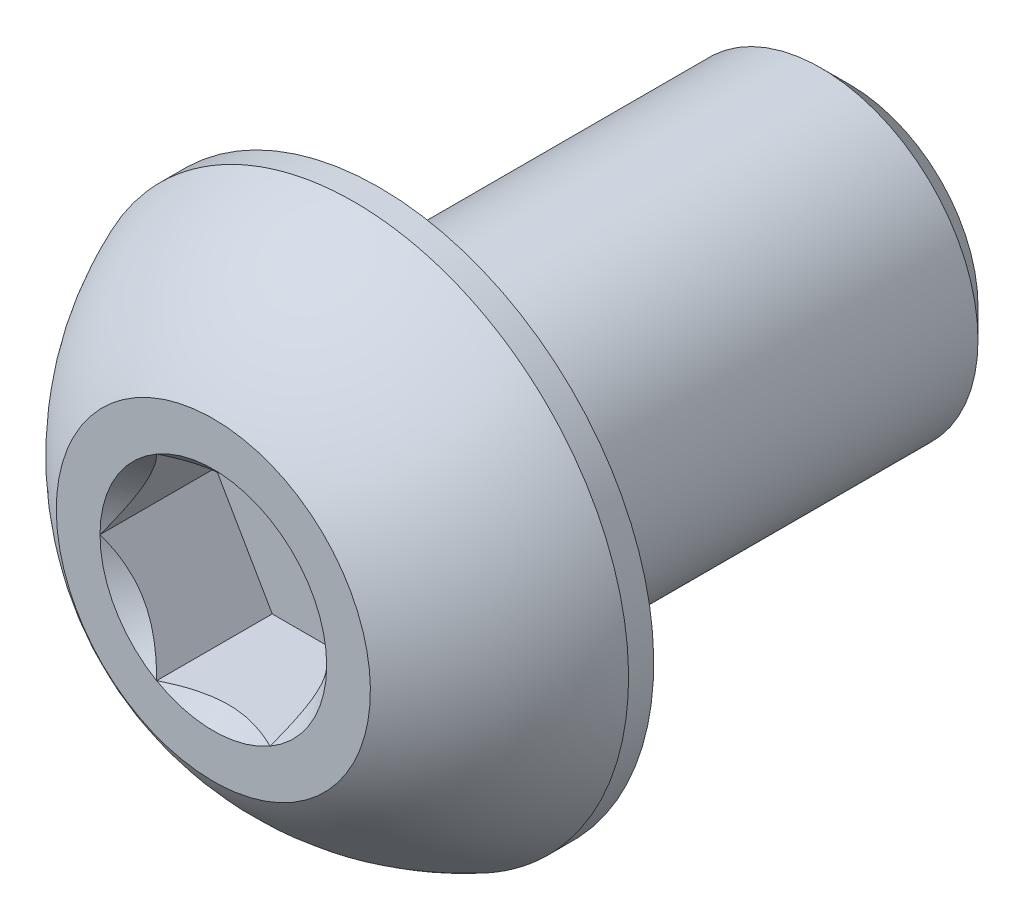
ISO-10303-21;
HEADER;
FILE_DESCRIPTION(('STEP AP214'),'2;1');
FILE_NAME('part.step','',(''),(''),'','','');
FILE_SCHEMA(('AUTOMOTIVE_DESIGN { 1 0 10303 214 1 1 1 1 }'));
ENDSEC;
DATA;
#1=APPLICATION_CONTEXT('core data for automotive mechanical design processes');
#2=APPLICATION_PROTOCOL_DEFINITION('international standard','automotive_design',2000,#1);
#3=PRODUCT_CONTEXT('',#1,'mechanical');
#4=PRODUCT('Part','Part','',(#3));
#5=PRODUCT_RELATED_PRODUCT_CATEGORY('part','',(#4));
#6=PRODUCT_DEFINITION_FORMATION('','',#4);
#7=PRODUCT_DEFINITION_CONTEXT('part definition',#1,'design');
#8=PRODUCT_DEFINITION('design','',#6,#7);
#9=PRODUCT_DEFINITION_SHAPE('','',#8);
#10=(LENGTH_UNIT() NAMED_UNIT(*) SI_UNIT(.MILLI.,.METRE.));
#11=(NAMED_UNIT(*) PLANE_ANGLE_UNIT() SI_UNIT($,.RADIAN.));
#12=(NAMED_UNIT(*) SI_UNIT($,.STERADIAN.) SOLID_ANGLE_UNIT());
#13=UNCERTAINTY_MEASURE_WITH_UNIT(LENGTH_MEASURE(1.E-05),#10,'distance_accuracy_value','');
#14=(GEOMETRIC_REPRESENTATION_CONTEXT(3) GLOBAL_UNCERTAINTY_ASSIGNED_CONTEXT((#13)) GLOBAL_UNIT_ASSIGNED_CONTEXT((#10,
#11,#12)) REPRESENTATION_CONTEXT('',''));
#15=CARTESIAN_POINT('',(0.,0.,0.));
#16=DIRECTION('',(0.,0.,1.));
#17=DIRECTION('',(1.,0.,0.));
#18=AXIS2_PLACEMENT_3D('',#15,#16,#17);
#19=CARTESIAN_POINT('',(0.,0.,10.541));
#20=DIRECTION('',(0.,0.,1.));
#21=DIRECTION('',(1.,0.,0.));
#22=AXIS2_PLACEMENT_3D('',#19,#20,#21);
#23=PLANE('',#22);
#24=DIRECTION('',(0.5,-0.866025403784439,0.));
#25=VECTOR('',#24,1.);
#26=CARTESIAN_POINT('',(-2.29135888084633,0.,10.541));
#27=LINE('',#26,#25);
#28=CARTESIAN_POINT('',(-2.29135888084633,0.,10.541));
#29=VERTEX_POINT('',#28);
#30=CARTESIAN_POINT('',(-1.14567944042316,-1.98437500000003,10.541));
#31=VERTEX_POINT('',#30);
#32=EDGE_CURVE('E97',#29,#31,#27,.T.);
#33=ORIENTED_EDGE('',*,*,#32,.T.);
#34=DIRECTION('',(1.,0.,0.));
#35=VECTOR('',#34,1.);
#36=CARTESIAN_POINT('',(-1.14567944042316,-1.98437500000003,10.541));
#37=LINE('',#36,#35);
#38=CARTESIAN_POINT('',(1.14567944042315,-1.98437500000005,10.541));
#39=VERTEX_POINT('',#38);
#40=EDGE_CURVE('E99',#31,#39,#37,.T.);
#41=ORIENTED_EDGE('',*,*,#40,.T.);
#42=DIRECTION('',(0.5,0.866025403784439,0.));
#43=VECTOR('',#42,1.);
#44=CARTESIAN_POINT('',(1.14567944042316,-1.98437500000003,10.541));
#45=LINE('',#44,#43);
#46=CARTESIAN_POINT('',(2.29135888084631,0.,10.541));
#47=VERTEX_POINT('',#46);
#48=EDGE_CURVE('E100',#39,#47,#45,.T.);
#49=ORIENTED_EDGE('',*,*,#48,.T.);
#50=DIRECTION('',(-0.500000000000001,0.866025403784438,0.));
#51=VECTOR('',#50,1.);
#52=CARTESIAN_POINT('',(2.29135888084633,0.,10.541));
#53=LINE('',#52,#51);
#54=CARTESIAN_POINT('',(1.14567944042316,1.98437499999997,10.541));
#55=VERTEX_POINT('',#54);
#56=EDGE_CURVE('E82',#47,#55,#53,.T.);
#57=ORIENTED_EDGE('',*,*,#56,.T.);
#58=DIRECTION('',(1.,0.,0.));
#59=VECTOR('',#58,1.);
#60=CARTESIAN_POINT('',(1.14567944042316,1.98437499999997,10.541));
#61=LINE('',#60,#59);
#62=CARTESIAN_POINT('',(-1.14567944042316,1.98437499999997,10.541));
#63=VERTEX_POINT('',#62);
#64=EDGE_CURVE('E133',#55,#63,#61,.F.);
#65=ORIENTED_EDGE('',*,*,#64,.T.);
#66=DIRECTION('',(-0.5,-0.866025403784439,0.));
#67=VECTOR('',#66,1.);
#68=CARTESIAN_POINT('',(-1.14567944042316,1.98437499999997,10.541));
#69=LINE('',#68,#67);
#70=EDGE_CURVE('E139',#63,#29,#69,.T.);
#71=ORIENTED_EDGE('',*,*,#70,.T.);
#72=EDGE_LOOP('',(#33,#41,#49,#57,#65,#71));
#73=FACE_BOUND('',#72,.T.);
#74=ADVANCED_FACE('F17',(#73),#23,.T.);
#75=CARTESIAN_POINT('',(1.14567944042316,-1.98437500000003,10.541));
#76=DIRECTION('',(0.866025403784439,-0.5,0.));
#77=DIRECTION('',(0.5,0.866025403784439,0.));
#78=AXIS2_PLACEMENT_3D('',#75,#76,#77);
#79=PLANE('',#78);
#80=CARTESIAN_POINT('',(1.14567944042435,-1.98437499999798,12.8777999999757));
#81=CARTESIAN_POINT('',(1.18505700231552,-1.91617106212428,12.8384602279496));
#82=CARTESIAN_POINT('',(1.22509295784978,-1.84682675300937,12.8014313284623));
#83=CARTESIAN_POINT('',(1.30673037976418,-1.70542659045469,12.7336329942744));
#84=CARTESIAN_POINT('',(1.34833960562514,-1.6333572971999,12.7029012702182));
#85=CARTESIAN_POINT('',(1.43224256860209,-1.48803310241826,12.6502576201332));
#86=CARTESIAN_POINT('',(1.47451494968019,-1.41481519063407,12.6282134119881));
#87=CARTESIAN_POINT('',(1.55999007977381,-1.26676792252837,12.5942501107053));
#88=CARTESIAN_POINT('',(1.6031902195242,-1.19194308558662,12.5823056747513));
#89=CARTESIAN_POINT('',(1.67764765055209,-1.06297903204525,12.5715284275558));
#90=CARTESIAN_POINT('',(1.70880881707529,-1.00900630840396,12.5699335279808));
#91=CARTESIAN_POINT('',(1.77108016542398,-0.901149169208195,12.5726239214188));
#92=CARTESIAN_POINT('',(1.80219032555297,-0.847264791233192,12.5769112754919));
#93=CARTESIAN_POINT('',(1.86411684097688,-0.740004920183282,12.5911221942489));
#94=CARTESIAN_POINT('',(1.89493282854882,-0.686630064023273,12.6010520604909));
#95=CARTESIAN_POINT('',(1.95603190280149,-0.580803363122215,12.6260029484807));
#96=CARTESIAN_POINT('',(1.98631503016411,-0.528351447918077,12.6410235797781));
#97=CARTESIAN_POINT('',(2.06386502548504,-0.394030915895498,12.6856047890371));
#98=CARTESIAN_POINT('',(2.11065153226316,-0.312994309047128,12.7185221338717));
#99=CARTESIAN_POINT('',(2.17944749410045,-0.193836207789382,12.7740895204166));
#100=CARTESIAN_POINT('',(2.2021189080202,-0.154568167000957,12.7936130937847));
#101=CARTESIAN_POINT('',(2.24704195200438,-0.0767591723897028,12.8344397006821));
#102=CARTESIAN_POINT('',(2.26929382922765,-0.0382177904752107,12.8557416436523));
#103=CARTESIAN_POINT('',(2.29135888084513,-2.09584513572769E-12,12.8777999999757));
#104=B_SPLINE_CURVE_WITH_KNOTS('',3,(#80,#81,#82,#83,#84,#85,#86,#87,#88,#89,#90,#91,#92,#93,
#94,#95,#96,#97,#98,#99,#100,#101,#102,#103),.UNSPECIFIED.,.F.,.F.,(4,2,2,2,2,2,2,2,2,2,2,4),
(0.,0.264284909620483,0.530108996346012,0.79171269539638,1.05265800172065,1.23942150114356,
1.42625045661504,1.61328847391834,1.80031214906307,2.09727151178582,2.24534838940884,
2.39333511884795),.UNSPECIFIED.);
#105=CARTESIAN_POINT('',(1.14567944041781,-1.98437499999085,12.8777999999663));
#106=VERTEX_POINT('',#105);
#107=CARTESIAN_POINT('',(2.29135888083512,1.73192417587704E-11,12.8777999999657));
#108=VERTEX_POINT('',#107);
#109=EDGE_CURVE('E20',#106,#108,#104,.T.);
#110=ORIENTED_EDGE('',*,*,#109,.T.);
#111=DIRECTION('',(0.,0.,1.));
#112=VECTOR('',#111,1.);
#113=CARTESIAN_POINT('',(2.2913588808463,0.,10.541));
#114=LINE('',#113,#112);
#115=EDGE_CURVE('E106',#108,#47,#114,.F.);
#116=ORIENTED_EDGE('',*,*,#115,.T.);
#117=ORIENTED_EDGE('',*,*,#48,.F.);
#118=DIRECTION('',(0.,0.,1.));
#119=VECTOR('',#118,1.);
#120=CARTESIAN_POINT('',(1.14567944042316,-1.98437500000003,10.541));
#121=LINE('',#120,#119);
#122=EDGE_CURVE('E69',#39,#106,#121,.T.);
#123=ORIENTED_EDGE('',*,*,#122,.T.);
#124=EDGE_LOOP('',(#110,#116,#117,#123));
#125=FACE_BOUND('',#124,.T.);
#126=ADVANCED_FACE('F105',(#125),#79,.F.);
#127=CARTESIAN_POINT('',(-1.14567944042316,-1.98437500000003,10.541));
#128=DIRECTION('',(0.,-1.,0.));
#129=DIRECTION('',(1.,0.,0.));
#130=AXIS2_PLACEMENT_3D('',#127,#128,#129);
#131=PLANE('',#130);
#132=CARTESIAN_POINT('',(-1.14567944042074,-1.98437500000003,12.8777999999757));
#133=CARTESIAN_POINT('',(-1.0669243166384,-1.98437500000003,12.8384602279496));
#134=CARTESIAN_POINT('',(-0.98685240556988,-1.98437500000003,12.8014313284622));
#135=CARTESIAN_POINT('',(-0.823577561741088,-1.98437500000003,12.7336329942744));
#136=CARTESIAN_POINT('',(-0.740359110019172,-1.98437500000003,12.7029012702182));
#137=CARTESIAN_POINT('',(-0.572553184065294,-1.98437500000003,12.6502576201332));
#138=CARTESIAN_POINT('',(-0.488008421909098,-1.98437500000003,12.6282134119881));
#139=CARTESIAN_POINT('',(-0.317058161721878,-1.98437500000003,12.5942501107053));
#140=CARTESIAN_POINT('',(-0.230657882221103,-1.98437500000003,12.5823056747513));
#141=CARTESIAN_POINT('',(-0.0817430201653199,-1.98437500000003,12.5715284275559));
#142=CARTESIAN_POINT('',(-0.0194206871189255,-1.98437500000003,12.5699335279808));
#143=CARTESIAN_POINT('',(0.105122009578469,-1.98437500000003,12.5726239214189));
#144=CARTESIAN_POINT('',(0.167342329836437,-1.98437500000003,12.5769112754919));
#145=CARTESIAN_POINT('',(0.291195360684257,-1.98437500000003,12.5911221942489));
#146=CARTESIAN_POINT('',(0.352827335828134,-1.98437500000003,12.6010520604909));
#147=CARTESIAN_POINT('',(0.475025484333487,-1.98437500000003,12.6260029484808));
#148=CARTESIAN_POINT('',(0.535591739058729,-1.98437500000003,12.6410235797781));
#149=CARTESIAN_POINT('',(0.69069172970057,-1.98437500000003,12.6856047890372));
#150=CARTESIAN_POINT('',(0.784264743256794,-1.98437500000003,12.7185221338718));
#151=CARTESIAN_POINT('',(0.921856666931339,-1.98437500000003,12.7740895204166));
#152=CARTESIAN_POINT('',(0.967199494770824,-1.98437500000003,12.7936130937847));
#153=CARTESIAN_POINT('',(1.05704558273917,-1.98437500000003,12.8344397006821));
#154=CARTESIAN_POINT('',(1.10154933718571,-1.98437500000003,12.8557416436523));
#155=CARTESIAN_POINT('',(1.14567944042067,-1.98437500000003,12.8777999999756));
#156=B_SPLINE_CURVE_WITH_KNOTS('',3,(#132,#133,#134,#135,#136,#137,#138,#139,#140,#141,#142,
#143,#144,#145,#146,#147,#148,#149,#150,#151,#152,#153,#154,#155),.UNSPECIFIED.,.F.,.F.,(4,2,2,
2,2,2,2,2,2,2,2,4),(0.,0.264284909620463,0.530108996345974,0.791712695396321,1.05265800172057,
1.23942150114349,1.42625045661497,1.61328847391826,1.80031214906299,2.09727151178569,
2.24534838940869,2.39333511884777),.UNSPECIFIED.);
#157=CARTESIAN_POINT('',(-1.14567944041785,-1.98437499999083,12.8777999999663));
#158=VERTEX_POINT('',#157);
#159=EDGE_CURVE('E111',#158,#106,#156,.T.);
#160=ORIENTED_EDGE('',*,*,#159,.T.);
#161=ORIENTED_EDGE('',*,*,#122,.F.);
#162=ORIENTED_EDGE('',*,*,#40,.F.);
#163=DIRECTION('',(0.,0.,1.));
#164=VECTOR('',#163,1.);
#165=CARTESIAN_POINT('',(-1.14567944042316,-1.98437500000003,10.541));
#166=LINE('',#165,#164);
#167=EDGE_CURVE('E118',#31,#158,#166,.T.);
#168=ORIENTED_EDGE('',*,*,#167,.T.);
#169=EDGE_LOOP('',(#160,#161,#162,#168));
#170=FACE_BOUND('',#169,.T.);
#171=ADVANCED_FACE('F109',(#170),#131,.F.);
#172=CARTESIAN_POINT('',(-2.29135888084633,0.,10.541));
#173=DIRECTION('',(-0.866025403784439,-0.5,0.));
#174=DIRECTION('',(0.5,-0.866025403784439,0.));
#175=AXIS2_PLACEMENT_3D('',#172,#173,#174);
#176=PLANE('',#175);
#177=CARTESIAN_POINT('',(-2.29135888084514,-2.09141642877542E-12,12.8777999999757));
#178=CARTESIAN_POINT('',(-2.25198131895396,-0.0682039378757894,12.8384602279496));
#179=CARTESIAN_POINT('',(-2.21194536341971,-0.137548246990695,12.8014313284622));
#180=CARTESIAN_POINT('',(-2.13030794150531,-0.278948409545368,12.7336329942744));
#181=CARTESIAN_POINT('',(-2.08869871564435,-0.351017702800158,12.7029012702182));
#182=CARTESIAN_POINT('',(-2.00479575266741,-0.496341897581788,12.6502576201332));
#183=CARTESIAN_POINT('',(-1.96252337158931,-0.569559809365968,12.628213411988));
#184=CARTESIAN_POINT('',(-1.8770482414957,-0.717607077471661,12.5942501107053));
#185=CARTESIAN_POINT('',(-1.83384810174531,-0.79243191441341,12.5823056747512));
#186=CARTESIAN_POINT('',(-1.75939067071742,-0.921395967954774,12.5715284275558));
#187=CARTESIAN_POINT('',(-1.72822950419422,-0.975368691596065,12.5699335279808));
#188=CARTESIAN_POINT('',(-1.66595815584553,-1.08322583079183,12.5726239214188));
#189=CARTESIAN_POINT('',(-1.63484799571654,-1.13711020876683,12.5769112754919));
#190=CARTESIAN_POINT('',(-1.57292148029263,-1.24437007981674,12.5911221942489));
#191=CARTESIAN_POINT('',(-1.54210549272069,-1.29774493597675,12.6010520604909));
#192=CARTESIAN_POINT('',(-1.48100641846802,-1.40357163687781,12.6260029484807));
#193=CARTESIAN_POINT('',(-1.4507232911054,-1.45602355208195,12.6410235797781));
#194=CARTESIAN_POINT('',(-1.37317329578447,-1.59034408410453,12.6856047890371));
#195=CARTESIAN_POINT('',(-1.32638678900635,-1.6713806909529,12.7185221338718));
#196=CARTESIAN_POINT('',(-1.25759082716906,-1.79053879221065,12.7740895204166));
#197=CARTESIAN_POINT('',(-1.23491941324931,-1.82980683299907,12.7936130937847));
#198=CARTESIAN_POINT('',(-1.18999636926513,-1.90761582761033,12.8344397006821));
#199=CARTESIAN_POINT('',(-1.16774449204186,-1.94615720952482,12.8557416436524));
#200=CARTESIAN_POINT('',(-1.14567944042437,-1.98437499999793,12.8777999999757));
#201=B_SPLINE_CURVE_WITH_KNOTS('',3,(#177,#178,#179,#180,#181,#182,#183,#184,#185,#186,#187,
#188,#189,#190,#191,#192,#193,#194,#195,#196,#197,#198,#199,#200),.UNSPECIFIED.,.F.,.F.,(4,2,2,
2,2,2,2,2,2,2,2,4),(0.,0.264284909620468,0.530108996345982,0.791712695396334,1.05265800172059,
1.2394215011435,1.42625045661498,1.61328847391827,1.800312149063,2.09727151178576,
2.24534838940879,2.3933351188479),.UNSPECIFIED.);
#202=CARTESIAN_POINT('',(-2.29135888083571,0.,12.8777999999663));
#203=VERTEX_POINT('',#202);
#204=EDGE_CURVE('E237',#203,#158,#201,.T.);
#205=ORIENTED_EDGE('',*,*,#204,.T.);
#206=ORIENTED_EDGE('',*,*,#167,.F.);
#207=ORIENTED_EDGE('',*,*,#32,.F.);
#208=DIRECTION('',(0.,0.,1.));
#209=VECTOR('',#208,1.);
#210=CARTESIAN_POINT('',(-2.29135888084633,0.,10.541));
#211=LINE('',#210,#209);
#212=EDGE_CURVE('E136',#29,#203,#211,.T.);
#213=ORIENTED_EDGE('',*,*,#212,.T.);
#214=EDGE_LOOP('',(#205,#206,#207,#213));
#215=FACE_BOUND('',#214,.T.);
#216=ADVANCED_FACE('F225',(#215),#176,.F.);
#217=CARTESIAN_POINT('',(-1.14567944042316,1.98437499999997,10.541));
#218=DIRECTION('',(-0.866025403784439,0.5,0.));
#219=DIRECTION('',(-0.5,-0.866025403784439,0.));
#220=AXIS2_PLACEMENT_3D('',#217,#218,#219);
#221=PLANE('',#220);
#222=CARTESIAN_POINT('',(-1.14567944042436,1.9843749999979,12.8777999999756));
#223=CARTESIAN_POINT('',(-1.18505700231553,1.9161710621242,12.8384602279495));
#224=CARTESIAN_POINT('',(-1.22509295784979,1.8468267530093,12.8014313284622));
#225=CARTESIAN_POINT('',(-1.30673037976419,1.70542659045463,12.7336329942744));
#226=CARTESIAN_POINT('',(-1.34833960562514,1.63335729719984,12.7029012702181));
#227=CARTESIAN_POINT('',(-1.43224256860208,1.48803310241821,12.6502576201332));
#228=CARTESIAN_POINT('',(-1.47451494968018,1.41481519063403,12.628213411988));
#229=CARTESIAN_POINT('',(-1.55999007977379,1.26676792252834,12.5942501107052));
#230=CARTESIAN_POINT('',(-1.60319021952418,1.19194308558659,12.5823056747512));
#231=CARTESIAN_POINT('',(-1.67764765055207,1.06297903204523,12.5715284275558));
#232=CARTESIAN_POINT('',(-1.70880881707527,1.00900630840393,12.5699335279807));
#233=CARTESIAN_POINT('',(-1.77108016542396,0.901149169208173,12.5726239214188));
#234=CARTESIAN_POINT('',(-1.80219032555295,0.84726479123317,12.5769112754919));
#235=CARTESIAN_POINT('',(-1.86411684097685,0.740004920183263,12.5911221942488));
#236=CARTESIAN_POINT('',(-1.89493282854879,0.686630064023255,12.6010520604909));
#237=CARTESIAN_POINT('',(-1.95603190280147,0.580803363122198,12.6260029484807));
#238=CARTESIAN_POINT('',(-1.98631503016409,0.528351447918061,12.641023579778));
#239=CARTESIAN_POINT('',(-2.06386502548502,0.394030915895484,12.6856047890371));
#240=CARTESIAN_POINT('',(-2.11065153226314,0.312994309047113,12.7185221338717));
#241=CARTESIAN_POINT('',(-2.17944749410042,0.193836207789368,12.7740895204166));
#242=CARTESIAN_POINT('',(-2.20211890802017,0.154568167000943,12.7936130937847));
#243=CARTESIAN_POINT('',(-2.24704195200435,0.0767591723896899,12.8344397006821));
#244=CARTESIAN_POINT('',(-2.26929382922762,0.0382177904751982,12.8557416436523));
#245=CARTESIAN_POINT('',(-2.29135888084511,2.08428185897202E-12,12.8777999999756));
#246=B_SPLINE_CURVE_WITH_KNOTS('',3,(#222,#223,#224,#225,#226,#227,#228,#229,#230,#231,#232,
#233,#234,#235,#236,#237,#238,#239,#240,#241,#242,#243,#244,#245),.UNSPECIFIED.,.F.,.F.,(4,2,2,
2,2,2,2,2,2,2,2,4),(0.,0.264284909620465,0.530108996345977,0.791712695396327,1.05265800172058,
1.23942150114349,1.42625045661497,1.61328847391826,1.80031214906298,2.09727151178573,
2.24534838940876,2.39333511884786),.UNSPECIFIED.);
#247=CARTESIAN_POINT('',(-1.14567944041786,1.98437499999079,12.8777999999662));
#248=VERTEX_POINT('',#247);
#249=EDGE_CURVE('E229',#248,#203,#246,.T.);
#250=ORIENTED_EDGE('',*,*,#249,.T.);
#251=ORIENTED_EDGE('',*,*,#212,.F.);
#252=ORIENTED_EDGE('',*,*,#70,.F.);
#253=DIRECTION('',(0.,0.,1.));
#254=VECTOR('',#253,1.);
#255=CARTESIAN_POINT('',(-1.14567944042316,1.98437499999997,10.541));
#256=LINE('',#255,#254);
#257=EDGE_CURVE('E130',#63,#248,#256,.T.);
#258=ORIENTED_EDGE('',*,*,#257,.T.);
#259=EDGE_LOOP('',(#250,#251,#252,#258));
#260=FACE_BOUND('',#259,.T.);
#261=ADVANCED_FACE('F221',(#260),#221,.F.);
#262=CARTESIAN_POINT('',(1.14567944042316,1.98437499999997,10.541));
#263=DIRECTION('',(0.,1.,0.));
#264=DIRECTION('',(0.,0.,1.));
#265=AXIS2_PLACEMENT_3D('',#262,#263,#264);
#266=PLANE('',#265);
#267=CARTESIAN_POINT('',(1.14567944042077,1.98437499999997,12.8777999999756));
#268=CARTESIAN_POINT('',(1.06692431663843,1.98437499999997,12.8384602279495));
#269=CARTESIAN_POINT('',(0.986852405569907,1.98437499999997,12.8014313284622));
#270=CARTESIAN_POINT('',(0.823577561741111,1.98437499999997,12.7336329942743));
#271=CARTESIAN_POINT('',(0.740359110019193,1.98437499999997,12.7029012702181));
#272=CARTESIAN_POINT('',(0.572553184065312,1.98437499999997,12.6502576201332));
#273=CARTESIAN_POINT('',(0.488008421909114,1.98437499999997,12.628213411988));
#274=CARTESIAN_POINT('',(0.317058161721891,1.98437499999997,12.5942501107052));
#275=CARTESIAN_POINT('',(0.230657882221114,1.98437499999997,12.5823056747512));
#276=CARTESIAN_POINT('',(0.0817430201653302,1.98437499999997,12.5715284275558));
#277=CARTESIAN_POINT('',(0.0194206871189376,1.98437499999997,12.5699335279807));
#278=CARTESIAN_POINT('',(-0.105122009578454,1.98437499999997,12.5726239214188));
#279=CARTESIAN_POINT('',(-0.16734232983642,1.98437499999997,12.5769112754919));
#280=CARTESIAN_POINT('',(-0.291195360684236,1.98437499999997,12.5911221942488));
#281=CARTESIAN_POINT('',(-0.352827335828112,1.98437499999997,12.6010520604909));
#282=CARTESIAN_POINT('',(-0.475025484333461,1.98437499999997,12.6260029484807));
#283=CARTESIAN_POINT('',(-0.535591739058701,1.98437499999997,12.641023579778));
#284=CARTESIAN_POINT('',(-0.690691729700565,1.98437499999997,12.6856047890371));
#285=CARTESIAN_POINT('',(-0.784264743256812,1.98437499999997,12.7185221338717));
#286=CARTESIAN_POINT('',(-0.921856666931389,1.98437499999997,12.7740895204166));
#287=CARTESIAN_POINT('',(-0.967199494770885,1.98437499999997,12.7936130937846));
#288=CARTESIAN_POINT('',(-1.05704558273925,1.98437499999997,12.8344397006821));
#289=CARTESIAN_POINT('',(-1.1015493371858,1.98437499999997,12.8557416436523));
#290=CARTESIAN_POINT('',(-1.14567944042077,1.98437499999997,12.8777999999756));
#291=B_SPLINE_CURVE_WITH_KNOTS('',3,(#267,#268,#269,#270,#271,#272,#273,#274,#275,#276,#277,
#278,#279,#280,#281,#282,#283,#284,#285,#286,#287,#288,#289,#290),.UNSPECIFIED.,.F.,.F.,(4,2,2,
2,2,2,2,2,2,2,2,4),(0.,0.264284909620471,0.530108996345988,0.791712695396343,1.0526580017206,
1.23942150114351,1.42625045661499,1.61328847391827,1.800312149063,2.09727151178577,
2.2453483894088,2.39333511884792),.UNSPECIFIED.);
#292=CARTESIAN_POINT('',(1.14567944041786,1.98437499999079,12.8777999999662));
#293=VERTEX_POINT('',#292);
#294=EDGE_CURVE('E202',#293,#248,#291,.T.);
#295=ORIENTED_EDGE('',*,*,#294,.T.);
#296=ORIENTED_EDGE('',*,*,#257,.F.);
#297=ORIENTED_EDGE('',*,*,#64,.F.);
#298=DIRECTION('',(0.,0.,1.));
#299=VECTOR('',#298,1.);
#300=CARTESIAN_POINT('',(1.14567944042316,1.98437499999997,10.541));
#301=LINE('',#300,#299);
#302=EDGE_CURVE('E45',#55,#293,#301,.T.);
#303=ORIENTED_EDGE('',*,*,#302,.T.);
#304=EDGE_LOOP('',(#295,#296,#297,#303));
#305=FACE_BOUND('',#304,.T.);
#306=ADVANCED_FACE('F214',(#305),#266,.F.);
#307=CARTESIAN_POINT('',(2.29135888084633,0.,10.541));
#308=DIRECTION('',(0.866025403784438,0.500000000000001,0.));
#309=DIRECTION('',(-0.500000000000001,0.866025403784438,0.));
#310=AXIS2_PLACEMENT_3D('',#307,#308,#309);
#311=PLANE('',#310);
#312=CARTESIAN_POINT('',(2.29135888084511,2.07980783222789E-12,12.8777999999757));
#313=CARTESIAN_POINT('',(2.25198131895394,0.0682039378757778,12.8384602279495));
#314=CARTESIAN_POINT('',(2.21194536341968,0.137548246990683,12.8014313284622));
#315=CARTESIAN_POINT('',(2.13030794150528,0.278948409545355,12.7336329942744));
#316=CARTESIAN_POINT('',(2.08869871564432,0.351017702800144,12.7029012702181));
#317=CARTESIAN_POINT('',(2.00479575266738,0.496341897581773,12.6502576201332));
#318=CARTESIAN_POINT('',(1.96252337158928,0.569559809365953,12.628213411988));
#319=CARTESIAN_POINT('',(1.87704824149567,0.717607077471646,12.5942501107052));
#320=CARTESIAN_POINT('',(1.83384810174528,0.792431914413395,12.5823056747512));
#321=CARTESIAN_POINT('',(1.75939067071739,0.921395967954758,12.5715284275558));
#322=CARTESIAN_POINT('',(1.7282295041942,0.975368691596048,12.5699335279807));
#323=CARTESIAN_POINT('',(1.6659581558455,1.08322583079181,12.5726239214188));
#324=CARTESIAN_POINT('',(1.63484799571652,1.13711020876681,12.5769112754919));
#325=CARTESIAN_POINT('',(1.57292148029261,1.24437007981672,12.5911221942488));
#326=CARTESIAN_POINT('',(1.54210549272067,1.29774493597673,12.6010520604909));
#327=CARTESIAN_POINT('',(1.481006418468,1.40357163687778,12.6260029484807));
#328=CARTESIAN_POINT('',(1.45072329110538,1.45602355208192,12.641023579778));
#329=CARTESIAN_POINT('',(1.37317329578445,1.5903440841045,12.6856047890371));
#330=CARTESIAN_POINT('',(1.32638678900633,1.67138069095287,12.7185221338717));
#331=CARTESIAN_POINT('',(1.25759082716904,1.79053879221062,12.7740895204166));
#332=CARTESIAN_POINT('',(1.2349194132493,1.82980683299904,12.7936130937847));
#333=CARTESIAN_POINT('',(1.18999636926511,1.90761582761029,12.8344397006821));
#334=CARTESIAN_POINT('',(1.16774449204184,1.94615720952478,12.8557416436523));
#335=CARTESIAN_POINT('',(1.14567944042436,1.9843749999979,12.8777999999756));
#336=B_SPLINE_CURVE_WITH_KNOTS('',3,(#312,#313,#314,#315,#316,#317,#318,#319,#320,#321,#322,
#323,#324,#325,#326,#327,#328,#329,#330,#331,#332,#333,#334,#335),.UNSPECIFIED.,.F.,.F.,(4,2,2,
2,2,2,2,2,2,2,2,4),(0.,0.264284909620467,0.53010899634598,0.791712695396331,1.05265800172058,
1.2394215011435,1.42625045661497,1.61328847391826,1.80031214906299,2.09727151178574,
2.24534838940876,2.39333511884787),.UNSPECIFIED.);
#337=EDGE_CURVE('E192',#108,#293,#336,.T.);
#338=ORIENTED_EDGE('',*,*,#337,.T.);
#339=ORIENTED_EDGE('',*,*,#302,.F.);
#340=ORIENTED_EDGE('',*,*,#56,.F.);
#341=ORIENTED_EDGE('',*,*,#115,.F.);
#342=EDGE_LOOP('',(#338,#339,#340,#341));
#343=FACE_BOUND('',#342,.T.);
#344=ADVANCED_FACE('F210',(#343),#311,.F.);
#345=CARTESIAN_POINT('',(0.,0.,12.8777999999556));
#346=DIRECTION('',(0.,0.,1.));
#347=DIRECTION('',(1.,0.,0.));
#348=AXIS2_PLACEMENT_3D('',#345,#346,#347);
#349=CONICAL_SURFACE('',#348,2.2913588808251,0.785398163397448);
#350=ORIENTED_EDGE('',*,*,#109,.F.);
#351=CARTESIAN_POINT('',(0.,0.,12.8777999999556));
#352=DIRECTION('',(0.,0.,1.));
#353=DIRECTION('',(1.,0.,0.));
#354=AXIS2_PLACEMENT_3D('',#351,#352,#353);
#355=CIRCLE('',#354,2.2913588808251);
#356=EDGE_CURVE('E201',#108,#106,#355,.F.);
#357=ORIENTED_EDGE('',*,*,#356,.F.);
#358=EDGE_LOOP('',(#350,#357));
#359=FACE_BOUND('',#358,.T.);
#360=ADVANCED_FACE('F213',(#359),#349,.F.);
#361=CARTESIAN_POINT('',(0.,0.,12.8777999999556));
#362=DIRECTION('',(0.,0.,1.));
#363=DIRECTION('',(1.,0.,0.));
#364=AXIS2_PLACEMENT_3D('',#361,#362,#363);
#365=CONICAL_SURFACE('',#364,2.2913588808251,0.785398163397448);
#366=ORIENTED_EDGE('',*,*,#159,.F.);
#367=CARTESIAN_POINT('',(0.,0.,12.8777999999556));
#368=DIRECTION('',(0.,0.,1.));
#369=DIRECTION('',(1.,0.,0.));
#370=AXIS2_PLACEMENT_3D('',#367,#368,#369);
#371=CIRCLE('',#370,2.2913588808251);
#372=EDGE_CURVE('E323',#106,#158,#371,.F.);
#373=ORIENTED_EDGE('',*,*,#372,.F.);
#374=EDGE_LOOP('',(#366,#373));
#375=FACE_BOUND('',#374,.T.);
#376=ADVANCED_FACE('F250',(#375),#365,.F.);
#377=CARTESIAN_POINT('',(0.,0.,12.8777999999556));
#378=DIRECTION('',(0.,0.,1.));
#379=DIRECTION('',(1.,0.,0.));
#380=AXIS2_PLACEMENT_3D('',#377,#378,#379);
#381=CONICAL_SURFACE('',#380,2.2913588808251,0.785398163397448);
#382=ORIENTED_EDGE('',*,*,#204,.F.);
#383=CARTESIAN_POINT('',(0.,0.,12.8777999999556));
#384=DIRECTION('',(0.,0.,1.));
#385=DIRECTION('',(1.,0.,0.));
#386=AXIS2_PLACEMENT_3D('',#383,#384,#385);
#387=CIRCLE('',#386,2.2913588808251);
#388=EDGE_CURVE('E319',#158,#203,#387,.F.);
#389=ORIENTED_EDGE('',*,*,#388,.F.);
#390=EDGE_LOOP('',(#382,#389));
#391=FACE_BOUND('',#390,.T.);
#392=ADVANCED_FACE('F246',(#391),#381,.F.);
#393=CARTESIAN_POINT('',(0.,0.,12.8777999999556));
#394=DIRECTION('',(0.,0.,1.));
#395=DIRECTION('',(1.,0.,0.));
#396=AXIS2_PLACEMENT_3D('',#393,#394,#395);
#397=CONICAL_SURFACE('',#396,2.2913588808251,0.785398163397448);
#398=ORIENTED_EDGE('',*,*,#249,.F.);
#399=CARTESIAN_POINT('',(0.,0.,12.8777999999556));
#400=DIRECTION('',(0.,0.,1.));
#401=DIRECTION('',(1.,0.,0.));
#402=AXIS2_PLACEMENT_3D('',#399,#400,#401);
#403=CIRCLE('',#402,2.2913588808251);
#404=EDGE_CURVE('E312',#203,#248,#403,.F.);
#405=ORIENTED_EDGE('',*,*,#404,.F.);
#406=EDGE_LOOP('',(#398,#405));
#407=FACE_BOUND('',#406,.T.);
#408=ADVANCED_FACE('F243',(#407),#397,.F.);
#409=CARTESIAN_POINT('',(0.,0.,12.8777999999556));
#410=DIRECTION('',(0.,0.,1.));
#411=DIRECTION('',(1.,0.,0.));
#412=AXIS2_PLACEMENT_3D('',#409,#410,#411);
#413=CONICAL_SURFACE('',#412,2.2913588808251,0.785398163397448);
#414=ORIENTED_EDGE('',*,*,#294,.F.);
#415=CARTESIAN_POINT('',(0.,0.,12.8777999999556));
#416=DIRECTION('',(0.,0.,1.));
#417=DIRECTION('',(1.,0.,0.));
#418=AXIS2_PLACEMENT_3D('',#415,#416,#417);
#419=CIRCLE('',#418,2.2913588808251);
#420=EDGE_CURVE('E307',#248,#293,#419,.F.);
#421=ORIENTED_EDGE('',*,*,#420,.F.);
#422=EDGE_LOOP('',(#414,#421));
#423=FACE_BOUND('',#422,.T.);
#424=ADVANCED_FACE('F187',(#423),#413,.F.);
#425=CARTESIAN_POINT('',(0.,0.,12.8777999999556));
#426=DIRECTION('',(0.,0.,1.));
#427=DIRECTION('',(1.,0.,0.));
#428=AXIS2_PLACEMENT_3D('',#425,#426,#427);
#429=CONICAL_SURFACE('',#428,2.2913588808251,0.785398163397448);
#430=ORIENTED_EDGE('',*,*,#337,.F.);
#431=CARTESIAN_POINT('',(0.,0.,12.8777999999556));
#432=DIRECTION('',(0.,0.,1.));
#433=DIRECTION('',(1.,0.,0.));
#434=AXIS2_PLACEMENT_3D('',#431,#432,#433);
#435=CIRCLE('',#434,2.2913588808251);
#436=EDGE_CURVE('E172',#293,#108,#435,.F.);
#437=ORIENTED_EDGE('',*,*,#436,.F.);
#438=EDGE_LOOP('',(#430,#437));
#439=FACE_BOUND('',#438,.T.);
#440=ADVANCED_FACE('F182',(#439),#429,.F.);
#441=CARTESIAN_POINT('',(0.,0.,12.8778));
#442=DIRECTION('',(0.,0.,1.));
#443=DIRECTION('',(0.,-1.,0.));
#444=AXIS2_PLACEMENT_3D('',#441,#442,#443);
#445=PLANE('',#444);
#446=CARTESIAN_POINT('',(0.,-3.175,12.8778));
#447=CARTESIAN_POINT('',(-0.0891440431949761,-3.17499946578888,12.8778));
#448=CARTESIAN_POINT('',(-0.178304469015907,-3.17124231565249,12.8778));
#449=CARTESIAN_POINT('',(-0.356009167569916,-3.1562381418787,12.8778));
#450=CARTESIAN_POINT('',(-0.444553250594692,-3.144988906996,12.8778));
#451=CARTESIAN_POINT('',(-0.620528053473836,-3.11505117443573,12.8778));
#452=CARTESIAN_POINT('',(-0.707956777537989,-3.09635086777691,12.8778));
#453=CARTESIAN_POINT('',(-0.880976698268375,-3.05163989606073,12.8778));
#454=CARTESIAN_POINT('',(-0.96656634284499,-3.02562329860019,12.8778));
#455=CARTESIAN_POINT('',(-1.21929335585575,-2.93695876364955,12.8778));
#456=CARTESIAN_POINT('',(-1.38281412178585,-2.86362325594715,12.8778));
#457=CARTESIAN_POINT('',(-1.69520451443577,-2.69050145233535,12.8778));
#458=CARTESIAN_POINT('',(-1.84407358390853,-2.59071415091922,12.8778));
#459=CARTESIAN_POINT('',(-2.05315401206347,-2.42346612457966,12.8778));
#460=CARTESIAN_POINT('',(-2.12051634455461,-2.36474478022374,12.8778));
#461=CARTESIAN_POINT('',(-2.25000832852246,-2.24188241400892,12.8778));
#462=CARTESIAN_POINT('',(-2.31214296247268,-2.177746672122,12.8778));
#463=CARTESIAN_POINT('',(-2.4308155706939,-2.044438112287,12.8778));
#464=CARTESIAN_POINT('',(-2.48735099697489,-1.97526302574645,12.8778));
#465=CARTESIAN_POINT('',(-2.59439910403857,-1.83240238976684,12.8778));
#466=CARTESIAN_POINT('',(-2.6449103868525,-1.75871579936436,12.8778));
#467=CARTESIAN_POINT('',(-2.78681055610983,-1.53169224589853,12.8778));
#468=CARTESIAN_POINT('',(-2.86869094579921,-1.3722506191143,12.8778));
#469=CARTESIAN_POINT('',(-3.00447172394576,-1.04196980448602,12.8778));
#470=CARTESIAN_POINT('',(-3.05837241123924,-0.871130738393934,12.8778));
#471=CARTESIAN_POINT('',(-3.13674176961128,-0.522806235086408,12.8778));
#472=CARTESIAN_POINT('',(-3.16121028350953,-0.345320762381556,12.8778));
#473=CARTESIAN_POINT('',(-3.17999537369743,0.0112387170595678,12.8778));
#474=CARTESIAN_POINT('',(-3.17431194998707,0.19031272379584,12.8778));
#475=CARTESIAN_POINT('',(-3.13297731868482,0.544943749216891,12.8778));
#476=CARTESIAN_POINT('',(-3.09732627113221,0.720500786678587,12.8778));
#477=CARTESIAN_POINT('',(-2.99700206831935,1.06322062934249,12.8778));
#478=CARTESIAN_POINT('',(-2.93232860308381,1.23038334486755,12.8778));
#479=CARTESIAN_POINT('',(-2.81506892595031,1.47106055604895,12.8778));
#480=CARTESIAN_POINT('',(-2.77258003218354,1.54964679659479,12.8778));
#481=CARTESIAN_POINT('',(-2.68113589553999,1.7029648594965,12.8778));
#482=CARTESIAN_POINT('',(-2.63218215227424,1.77769757015881,12.8778));
#483=CARTESIAN_POINT('',(-2.52817416346667,1.92273790362338,12.8778));
#484=CARTESIAN_POINT('',(-2.47312269018625,1.99304751472434,12.8778));
#485=CARTESIAN_POINT('',(-2.35725756637537,2.12883635089331,12.8778));
#486=CARTESIAN_POINT('',(-2.29643840615049,2.19431084876198,12.8778));
#487=CARTESIAN_POINT('',(-2.10608934285418,2.38260254229663,12.8778));
#488=CARTESIAN_POINT('',(-1.96852974551869,2.49748014041958,12.8778));
#489=CARTESIAN_POINT('',(-1.67605983081147,2.70246859203802,12.8778));
#490=CARTESIAN_POINT('',(-1.52115017325754,2.79258038692004,12.8778));
#491=CARTESIAN_POINT('',(-1.27913883380198,2.90730987065582,12.8778));
#492=CARTESIAN_POINT('',(-1.19675675066641,2.94217594270902,12.8778));
#493=CARTESIAN_POINT('',(-1.02939274539442,3.00481980673952,12.8778));
#494=CARTESIAN_POINT('',(-0.944412990114309,3.03260333518989,12.8778));
#495=CARTESIAN_POINT('',(-0.772558133517328,3.08086623339581,12.8778));
#496=CARTESIAN_POINT('',(-0.68568625779407,3.10135713704761,12.8778));
#497=CARTESIAN_POINT('',(-0.510541909034136,3.13495091945246,12.8778));
#498=CARTESIAN_POINT('',(-0.422269857006501,3.14805597727559,12.8778));
#499=CARTESIAN_POINT('',(-0.278217492188208,3.16327769663078,12.8778));
#500=CARTESIAN_POINT('',(-0.222667817423135,3.16767216929775,12.8778));
#501=CARTESIAN_POINT('',(-0.111414227898853,3.17353348790921,12.8778));
#502=CARTESIAN_POINT('',(-0.0557103131396446,3.17500033385371,12.8778));
#503=CARTESIAN_POINT('',(0.0891440431949763,3.17499946578888,12.8778));
#504=CARTESIAN_POINT('',(0.178304469015907,3.17124231565249,12.8778));
#505=CARTESIAN_POINT('',(0.356009167569917,3.1562381418787,12.8778));
#506=CARTESIAN_POINT('',(0.444553250594692,3.14498890699601,12.8778));
#507=CARTESIAN_POINT('',(0.620528053473837,3.11505117443574,12.8778));
#508=CARTESIAN_POINT('',(0.707956777537989,3.09635086777691,12.8778));
#509=CARTESIAN_POINT('',(0.880976698268375,3.05163989606073,12.8778));
#510=CARTESIAN_POINT('',(0.96656634284499,3.02562329860019,12.8778));
#511=CARTESIAN_POINT('',(1.21929335585575,2.93695876364956,12.8778));
#512=CARTESIAN_POINT('',(1.38281412178585,2.86362325594715,12.8778));
#513=CARTESIAN_POINT('',(1.69520451443577,2.69050145233535,12.8778));
#514=CARTESIAN_POINT('',(1.84407358390853,2.59071415091922,12.8778));
#515=CARTESIAN_POINT('',(2.05315401206347,2.42346612457966,12.8778));
#516=CARTESIAN_POINT('',(2.12051634455461,2.36474478022374,12.8778));
#517=CARTESIAN_POINT('',(2.25000832852247,2.24188241400893,12.8778));
#518=CARTESIAN_POINT('',(2.31214296247268,2.177746672122,12.8778));
#519=CARTESIAN_POINT('',(2.4308155706939,2.044438112287,12.8778));
#520=CARTESIAN_POINT('',(2.48735099697489,1.97526302574645,12.8778));
#521=CARTESIAN_POINT('',(2.59439910403857,1.83240238976684,12.8778));
#522=CARTESIAN_POINT('',(2.6449103868525,1.75871579936436,12.8778));
#523=CARTESIAN_POINT('',(2.78681055610983,1.53169224589853,12.8778));
#524=CARTESIAN_POINT('',(2.8686909457992,1.37225061911431,12.8778));
#525=CARTESIAN_POINT('',(3.00447172394576,1.04196980448602,12.8778));
#526=CARTESIAN_POINT('',(3.05837241123924,0.871130738393936,12.8778));
#527=CARTESIAN_POINT('',(3.13674176961128,0.522806235086411,12.8778));
#528=CARTESIAN_POINT('',(3.16121028350953,0.345320762381558,12.8778));
#529=CARTESIAN_POINT('',(3.17999537369743,-0.0112387170595666,12.8778));
#530=CARTESIAN_POINT('',(3.17431194998707,-0.190312723795839,12.8778));
#531=CARTESIAN_POINT('',(3.13297731868482,-0.54494374921689,12.8778));
#532=CARTESIAN_POINT('',(3.09732627113221,-0.720500786678587,12.8778));
#533=CARTESIAN_POINT('',(2.99700206831936,-1.06322062934249,12.8778));
#534=CARTESIAN_POINT('',(2.9323286030838,-1.23038334486755,12.8778));
#535=CARTESIAN_POINT('',(2.81506892595031,-1.47106055604895,12.8778));
#536=CARTESIAN_POINT('',(2.77258003218354,-1.54964679659479,12.8778));
#537=CARTESIAN_POINT('',(2.68113589554,-1.7029648594965,12.8778));
#538=CARTESIAN_POINT('',(2.63218215227424,-1.77769757015881,12.8778));
#539=CARTESIAN_POINT('',(2.52817416346667,-1.92273790362338,12.8778));
#540=CARTESIAN_POINT('',(2.47312269018625,-1.99304751472434,12.8778));
#541=CARTESIAN_POINT('',(2.35725756637537,-2.12883635089331,12.8778));
#542=CARTESIAN_POINT('',(2.29643840615049,-2.19431084876198,12.8778));
#543=CARTESIAN_POINT('',(2.10608934285419,-2.38260254229663,12.8778));
#544=CARTESIAN_POINT('',(1.96852974551869,-2.49748014041958,12.8778));
#545=CARTESIAN_POINT('',(1.67605983081147,-2.70246859203802,12.8778));
#546=CARTESIAN_POINT('',(1.52115017325754,-2.79258038692003,12.8778));
#547=CARTESIAN_POINT('',(1.27913883380198,-2.90730987065582,12.8778));
#548=CARTESIAN_POINT('',(1.19675675066641,-2.94217594270903,12.8778));
#549=CARTESIAN_POINT('',(1.02939274539442,-3.00481980673952,12.8778));
#550=CARTESIAN_POINT('',(0.94441299011431,-3.03260333518988,12.8778));
#551=CARTESIAN_POINT('',(0.772558133517328,-3.0808662333958,12.8778));
#552=CARTESIAN_POINT('',(0.685686257794071,-3.1013571370476,12.8778));
#553=CARTESIAN_POINT('',(0.510541909034139,-3.13495091945246,12.8778));
#554=CARTESIAN_POINT('',(0.422269857006503,-3.14805597727558,12.8778));
#555=CARTESIAN_POINT('',(0.27821749218821,-3.16327769663078,12.8778));
#556=CARTESIAN_POINT('',(0.222667817423137,-3.16767216929774,12.8778));
#557=CARTESIAN_POINT('',(0.111414227898854,-3.17353348790921,12.8778));
#558=CARTESIAN_POINT('',(0.0557103131396453,-3.1750003338537,12.8778));
#559=CARTESIAN_POINT('',(0.,-3.175,12.8778));
#560=B_SPLINE_CURVE_WITH_KNOTS('',3,(#446,#447,#448,#449,#450,#451,#452,#453,#454,#455,#456,
#457,#458,#459,#460,#461,#462,#463,#464,#465,#466,#467,#468,#469,#470,#471,#472,#473,#474,#475,
#476,#477,#478,#479,#480,#481,#482,#483,#484,#485,#486,#487,#488,#489,#490,#491,#492,#493,#494,
#495,#496,#497,#498,#499,#500,#501,#502,#503,#504,#505,#506,#507,#508,#509,#510,#511,#512,#513,
#514,#515,#516,#517,#518,#519,#520,#521,#522,#523,#524,#525,#526,#527,#528,#529,#530,#531,#532,
#533,#534,#535,#536,#537,#538,#539,#540,#541,#542,#543,#544,#545,#546,#547,#548,#549,#550,#551,
#552,#553,#554,#555,#556,#557,#558,#559),.UNSPECIFIED.,.T.,.F.,(4,2,2,2,2,2,2,2,2,2,2,2,2,2,2,2,
2,2,2,2,2,2,2,2,2,2,2,2,2,2,2,2,2,2,2,2,2,2,2,2,2,2,2,2,2,2,2,2,2,2,2,2,2,2,2,2,4),(0.,
0.267380842961492,0.534840636818115,0.802726016615612,1.0708292402934,1.60575767125611,
2.14070643926296,2.4085313146328,2.67609796648421,2.94378582378515,3.21153568062228,
3.74647713687887,4.28141287959311,4.81635147907858,5.35129007856405,5.88622582127829,
6.42116727753489,6.68891713437201,6.95660499167296,7.22417164352437,7.49199651889421,
8.02694528690106,8.56187371786377,8.82997694154155,9.09786232133905,9.36532211519567,
9.63270295815717,9.79980184614844,9.96690073413972,10.2342815771012,10.5017413709578,
10.7696267507553,11.0377299744331,11.5726584053958,12.1076071734027,12.3754320487725,
12.6429987006239,12.9106865579249,13.178436414762,13.7133778710186,14.2483136137328,
14.7832522132183,15.3181908127038,15.853126555418,16.3880680116746,16.6558178685117,
16.9235057258127,17.1910723776641,17.4588972530339,17.9938460210408,18.5287744520035,
18.7968776756813,19.0647630554788,19.3322228493354,19.5996036922969,19.7667025802882,
19.9338014682794),.UNSPECIFIED.);
#561=CARTESIAN_POINT('',(0.,-3.175,12.8778));
#562=VERTEX_POINT('',#561);
#563=EDGE_CURVE('E163',#562,#562,#560,.T.);
#564=ORIENTED_EDGE('',*,*,#563,.F.);
#565=EDGE_LOOP('',(#564));
#566=FACE_BOUND('',#565,.T.);
#567=ORIENTED_EDGE('',*,*,#420,.T.);
#568=ORIENTED_EDGE('',*,*,#436,.T.);
#569=ORIENTED_EDGE('',*,*,#356,.T.);
#570=ORIENTED_EDGE('',*,*,#372,.T.);
#571=ORIENTED_EDGE('',*,*,#388,.T.);
#572=ORIENTED_EDGE('',*,*,#404,.T.);
#573=EDGE_LOOP('',(#567,#568,#569,#570,#571,#572));
#574=FACE_BOUND('',#573,.T.);
#575=ADVANCED_FACE('F178',(#566,#574),#445,.T.);
#576=CARTESIAN_POINT('',(0.,0.,7.81353325892858));
#577=DIRECTION('',(0.,1.,0.));
#578=DIRECTION('',(0.,0.,1.));
#579=AXIS2_PLACEMENT_3D('',#576,#577,#578);
#580=SPHERICAL_SURFACE('',#579,5.97724205840137);
#581=ORIENTED_EDGE('',*,*,#563,.T.);
#582=EDGE_LOOP('',(#581));
#583=FACE_BOUND('',#582,.T.);
#584=CARTESIAN_POINT('',(0.,0.,10.033));
#585=DIRECTION('',(0.,0.,-1.));
#586=DIRECTION('',(0.,1.,0.));
#587=AXIS2_PLACEMENT_3D('',#584,#585,#586);
#588=CIRCLE('',#587,5.5499);
#589=CARTESIAN_POINT('',(0.,5.5499,10.033));
#590=VERTEX_POINT('',#589);
#591=EDGE_CURVE('E159',#590,#590,#588,.T.);
#592=ORIENTED_EDGE('',*,*,#591,.F.);
#593=EDGE_LOOP('',(#592));
#594=FACE_BOUND('',#593,.T.);
#595=ADVANCED_FACE('F174',(#583,#594),#580,.T.);
#596=CARTESIAN_POINT('',(0.,0.,9.525));
#597=DIRECTION('',(0.,0.,-1.));
#598=DIRECTION('',(0.,1.,0.));
#599=AXIS2_PLACEMENT_3D('',#596,#597,#598);
#600=CYLINDRICAL_SURFACE('',#599,5.5499);
#601=ORIENTED_EDGE('',*,*,#591,.T.);
#602=EDGE_LOOP('',(#601));
#603=FACE_BOUND('',#602,.T.);
#604=CARTESIAN_POINT('',(0.,0.,9.525));
#605=DIRECTION('',(0.,0.,-1.));
#606=DIRECTION('',(0.,1.,0.));
#607=AXIS2_PLACEMENT_3D('',#604,#605,#606);
#608=CIRCLE('',#607,5.5499);
#609=CARTESIAN_POINT('',(0.,5.5499,9.525));
#610=VERTEX_POINT('',#609);
#611=EDGE_CURVE('E155',#610,#610,#608,.T.);
#612=ORIENTED_EDGE('',*,*,#611,.F.);
#613=EDGE_LOOP('',(#612));
#614=FACE_BOUND('',#613,.T.);
#615=ADVANCED_FACE('F285',(#603,#614),#600,.T.);
#616=CARTESIAN_POINT('',(0.,0.,0.));
#617=DIRECTION('',(0.,0.,1.));
#618=DIRECTION('',(1.,0.,0.));
#619=AXIS2_PLACEMENT_3D('',#616,#617,#618);
#620=PLANE('',#619);
#621=CARTESIAN_POINT('',(0.,0.,0.));
#622=DIRECTION('',(0.,0.,1.));
#623=DIRECTION('',(1.,0.,0.));
#624=AXIS2_PLACEMENT_3D('',#621,#622,#623);
#625=CIRCLE('',#624,2.58064000001923);
#626=CARTESIAN_POINT('',(2.58064000001923,0.,0.));
#627=VERTEX_POINT('',#626);
#628=EDGE_CURVE('E151',#627,#627,#625,.T.);
#629=ORIENTED_EDGE('',*,*,#628,.F.);
#630=EDGE_LOOP('',(#629));
#631=FACE_BOUND('',#630,.T.);
#632=ADVANCED_FACE('F282',(#631),#620,.F.);
#633=CARTESIAN_POINT('',(0.,5.5499,9.525));
#634=DIRECTION('',(0.,0.,-1.));
#635=DIRECTION('',(0.,1.,0.));
#636=AXIS2_PLACEMENT_3D('',#633,#634,#635);
#637=PLANE('',#636);
#638=ORIENTED_EDGE('',*,*,#611,.T.);
#639=EDGE_LOOP('',(#638));
#640=FACE_BOUND('',#639,.T.);
#641=CARTESIAN_POINT('',(0.,0.,9.525));
#642=DIRECTION('',(0.,0.,-1.));
#643=DIRECTION('',(-1.,0.,0.));
#644=AXIS2_PLACEMENT_3D('',#641,#642,#643);
#645=CIRCLE('',#644,3.175);
#646=CARTESIAN_POINT('',(-3.175,0.,9.525));
#647=VERTEX_POINT('',#646);
#648=EDGE_CURVE('E32',#647,#647,#645,.T.);
#649=ORIENTED_EDGE('',*,*,#648,.F.);
#650=EDGE_LOOP('',(#649));
#651=FACE_BOUND('',#650,.T.);
#652=ADVANCED_FACE('F275',(#640,#651),#637,.T.);
#653=CARTESIAN_POINT('',(0.,0.,0.594359999979588));
#654=DIRECTION('',(0.,0.,1.));
#655=DIRECTION('',(1.,0.,0.));
#656=AXIS2_PLACEMENT_3D('',#653,#654,#655);
#657=CONICAL_SURFACE('',#656,3.17499999999882,0.785398163397448);
#658=CARTESIAN_POINT('',(0.,0.,0.594360000000009));
#659=DIRECTION('',(0.,0.,-1.));
#660=DIRECTION('',(-1.,0.,0.));
#661=AXIS2_PLACEMENT_3D('',#658,#659,#660);
#662=CIRCLE('',#661,3.175);
#663=CARTESIAN_POINT('',(-3.175,0.,0.594360000000009));
#664=VERTEX_POINT('',#663);
#665=EDGE_CURVE('E11',#664,#664,#662,.F.);
#666=ORIENTED_EDGE('',*,*,#665,.F.);
#667=EDGE_LOOP('',(#666));
#668=FACE_BOUND('',#667,.T.);
#669=ORIENTED_EDGE('',*,*,#628,.T.);
#670=EDGE_LOOP('',(#669));
#671=FACE_BOUND('',#670,.T.);
#672=ADVANCED_FACE('F269',(#668,#671),#657,.T.);
#673=CARTESIAN_POINT('',(0.,0.,9.525));
#674=DIRECTION('',(0.,0.,-1.));
#675=DIRECTION('',(-1.,0.,0.));
#676=AXIS2_PLACEMENT_3D('',#673,#674,#675);
#677=CYLINDRICAL_SURFACE('',#676,3.175);
#678=ORIENTED_EDGE('',*,*,#665,.T.);
#679=EDGE_LOOP('',(#678));
#680=FACE_BOUND('',#679,.T.);
#681=ORIENTED_EDGE('',*,*,#648,.T.);
#682=EDGE_LOOP('',(#681));
#683=FACE_BOUND('',#682,.T.);
#684=ADVANCED_FACE('F267',(#680,#683),#677,.T.);
#685=CLOSED_SHELL('',(#74,#126,#171,#216,#261,#306,#344,#360,#376,#392,#408,#424,#440,#575,#595,
#615,#632,#652,#672,#684));
#686=MANIFOLD_SOLID_BREP('B1',#685);
#687=ADVANCED_BREP_SHAPE_REPRESENTATION('',(#18,#686),#14);
#688=SHAPE_DEFINITION_REPRESENTATION(#9,#687);
ENDSEC;
END-ISO-10303-21;
